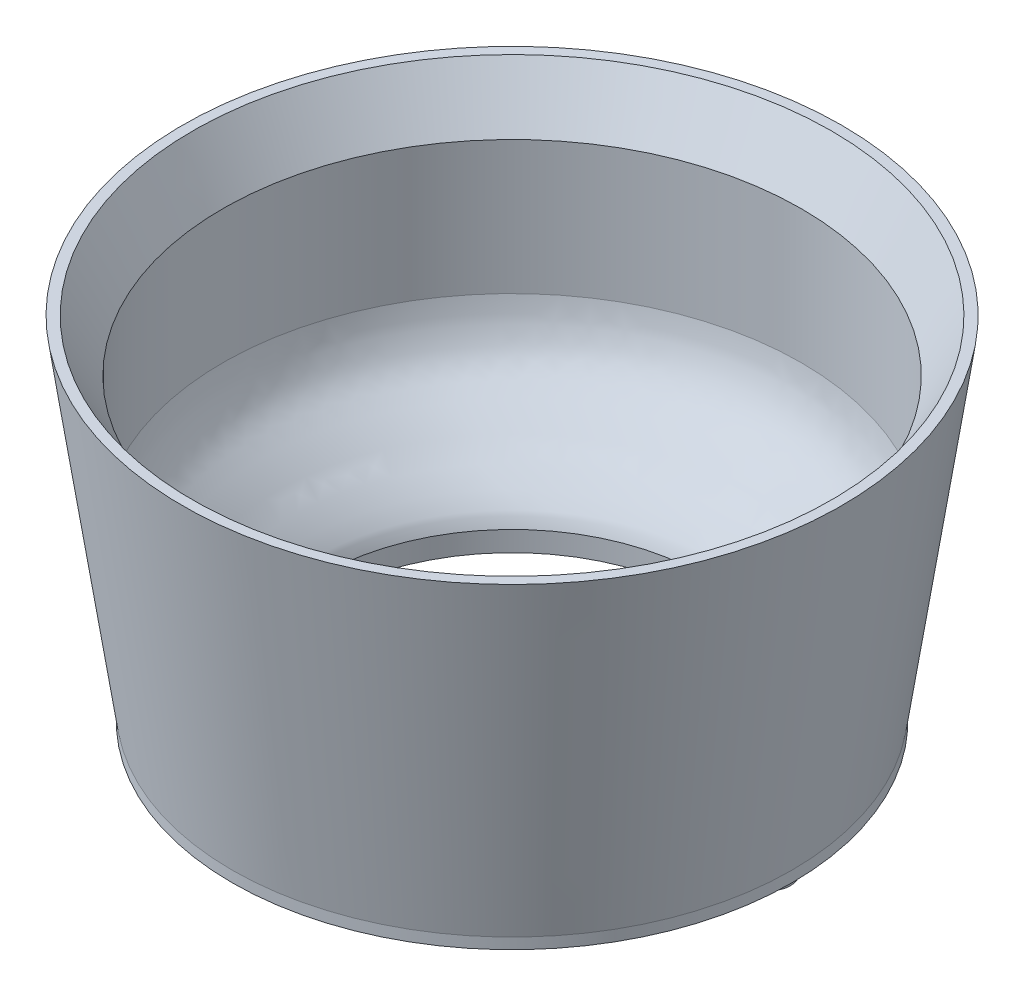
ISO-10303-21;
HEADER;
FILE_DESCRIPTION(('STEP AP214'),'2;1');
FILE_NAME('part.step','',(''),(''),'','','');
FILE_SCHEMA(('AUTOMOTIVE_DESIGN { 1 0 10303 214 1 1 1 1 }'));
ENDSEC;
DATA;
#1=APPLICATION_CONTEXT('core data for automotive mechanical design processes');
#2=APPLICATION_PROTOCOL_DEFINITION('international standard','automotive_design',2000,#1);
#3=PRODUCT_CONTEXT('',#1,'mechanical');
#4=PRODUCT('Part','Part','',(#3));
#5=PRODUCT_RELATED_PRODUCT_CATEGORY('part','',(#4));
#6=PRODUCT_DEFINITION_FORMATION('','',#4);
#7=PRODUCT_DEFINITION_CONTEXT('part definition',#1,'design');
#8=PRODUCT_DEFINITION('design','',#6,#7);
#9=PRODUCT_DEFINITION_SHAPE('','',#8);
#10=(LENGTH_UNIT() NAMED_UNIT(*) SI_UNIT(.MILLI.,.METRE.));
#11=(NAMED_UNIT(*) PLANE_ANGLE_UNIT() SI_UNIT($,.RADIAN.));
#12=(NAMED_UNIT(*) SI_UNIT($,.STERADIAN.) SOLID_ANGLE_UNIT());
#13=UNCERTAINTY_MEASURE_WITH_UNIT(LENGTH_MEASURE(1.E-05),#10,'distance_accuracy_value','');
#14=(GEOMETRIC_REPRESENTATION_CONTEXT(3) GLOBAL_UNCERTAINTY_ASSIGNED_CONTEXT((#13)) GLOBAL_UNIT_ASSIGNED_CONTEXT((#10,
#11,#12)) REPRESENTATION_CONTEXT('',''));
#15=CARTESIAN_POINT('',(0.,0.,0.));
#16=DIRECTION('',(0.,0.,1.));
#17=DIRECTION('',(1.,0.,0.));
#18=AXIS2_PLACEMENT_3D('',#15,#16,#17);
#19=CARTESIAN_POINT('',(0.,295.540718437762,-40.5476747547934));
#20=CARTESIAN_POINT('',(0.,295.012709615636,-40.4477404657415));
#21=CARTESIAN_POINT('',(0.,293.970757618623,-40.2927773525862));
#22=CARTESIAN_POINT('',(0.,292.587532752845,-39.930889754875));
#23=CARTESIAN_POINT('',(0.,291.581451359409,-39.51618641559));
#24=CARTESIAN_POINT('',(0.,290.578047280025,-39.1083707824325));
#25=CARTESIAN_POINT('',(0.,289.316986818185,-38.4396980542591));
#26=CARTESIAN_POINT('',(0.,288.032583078736,-37.3314160861705));
#27=CARTESIAN_POINT('',(0.,287.115418473763,-36.3683638812662));
#28=CARTESIAN_POINT('',(0.,286.340079672536,-35.6302312643945));
#29=CARTESIAN_POINT('',(0.,285.762737125999,-35.0164727262729));
#30=CARTESIAN_POINT('',(0.,285.247169223289,-34.3942597952709));
#31=CARTESIAN_POINT('',(0.,284.556557999368,-33.6355246615368));
#32=CARTESIAN_POINT('',(0.,283.771384037677,-32.9203613336381));
#33=CARTESIAN_POINT('',(0.,282.986073935963,-32.12965190107));
#34=CARTESIAN_POINT('',(0.,282.459482322822,-31.4852417836461));
#35=CARTESIAN_POINT('',(0.,281.963476572773,-30.9149972084707));
#36=CARTESIAN_POINT('',(0.,281.391298158875,-30.3717003462487));
#37=CARTESIAN_POINT('',(0.,280.804626849955,-29.7827961587849));
#38=CARTESIAN_POINT('',(0.,280.262154528045,-29.2275845813112));
#39=CARTESIAN_POINT('',(0.,279.674853681479,-28.7247526180959));
#40=CARTESIAN_POINT('',(0.,279.039651715273,-28.1803862534295));
#41=CARTESIAN_POINT('',(0.,278.470209991792,-27.651838315325));
#42=CARTESIAN_POINT('',(0.,277.876839186641,-27.3081459354535));
#43=CARTESIAN_POINT('',(0.,277.127164256162,-26.9952300805427));
#44=CARTESIAN_POINT('',(0.,276.164510632259,-26.5979526177344));
#45=CARTESIAN_POINT('',(0.,275.470548140668,-26.4648115829165));
#46=CARTESIAN_POINT('',(0.,274.996982716808,-26.5077562004189));
#47=B_SPLINE_CURVE_WITH_KNOTS('',3,(#19,#20,#21,#22,#23,#24,#25,#26,#27,#28,#29,#30,#31,#32,#33,
#34,#35,#36,#37,#38,#39,#40,#41,#42,#43,#44,#45,#46),.UNSPECIFIED.,.F.,.F.,(4,1,1,1,1,1,1,1,1,1,
1,1,1,1,1,1,1,1,1,1,1,1,1,1,1,4),(0.,0.0625440482121128,0.125088096424226,0.156360120530282,
0.187632144636338,0.250176192848451,0.312720241060564,0.375264289272677,0.406536313378733,
0.43780833748479,0.469080361590846,0.500352385696902,0.562896433909015,0.594168458015071,
0.625440482121128,0.656712506227184,0.687984530333241,0.719256554439297,0.750528578545353,
0.78180060265141,0.813072626757466,0.844344650863523,0.875616674969579,0.906888699075636,
0.938160723181692,1.0007047713938),.UNSPECIFIED.);
#48=CARTESIAN_POINT('',(0.,5.,0.));
#49=DIRECTION('',(0.,-1.,0.));
#50=AXIS1_PLACEMENT('',#48,#49);
#51=SURFACE_OF_REVOLUTION('',#47,#50);
#52=CARTESIAN_POINT('',(0.,276.641394028295,8.7005807280947E-13));
#53=DIRECTION('',(0.,-1.,0.));
#54=DIRECTION('',(0.,0.,-1.));
#55=AXIS2_PLACEMENT_3D('',#52,#53,#54);
#56=CIRCLE('',#55,26.8);
#57=CARTESIAN_POINT('',(0.,276.641394028295,-26.7999999999991));
#58=VERTEX_POINT('',#57);
#59=EDGE_CURVE('E58',#58,#58,#56,.F.);
#60=ORIENTED_EDGE('',*,*,#59,.F.);
#61=EDGE_LOOP('',(#60));
#62=FACE_BOUND('',#61,.T.);
#63=CARTESIAN_POINT('',(0.,295.540718437762,9.30591960996588E-13));
#64=DIRECTION('',(0.,-1.,0.));
#65=DIRECTION('',(0.,0.,-1.));
#66=AXIS2_PLACEMENT_3D('',#63,#64,#65);
#67=CIRCLE('',#66,40.5476747547944);
#68=CARTESIAN_POINT('',(0.,295.540718437762,-40.5476747547934));
#69=VERTEX_POINT('',#68);
#70=EDGE_CURVE('E50',#69,#69,#67,.T.);
#71=ORIENTED_EDGE('',*,*,#70,.F.);
#72=EDGE_LOOP('',(#71));
#73=FACE_BOUND('',#72,.T.);
#74=ADVANCED_FACE('F30',(#62,#73),#51,.F.);
#75=CARTESIAN_POINT('',(0.,5.,0.));
#76=DIRECTION('',(0.,-1.,0.));
#77=DIRECTION('',(0.,0.,-1.));
#78=AXIS2_PLACEMENT_3D('',#75,#76,#77);
#79=CYLINDRICAL_SURFACE('',#78,40.5476747547944);
#80=ORIENTED_EDGE('',*,*,#70,.T.);
#81=EDGE_LOOP('',(#80));
#82=FACE_BOUND('',#81,.T.);
#83=CARTESIAN_POINT('',(0.,314.238618936809,9.90480695303734E-13));
#84=DIRECTION('',(0.,-1.,0.));
#85=DIRECTION('',(0.,0.,-1.));
#86=AXIS2_PLACEMENT_3D('',#83,#84,#85);
#87=CIRCLE('',#86,40.5476747547944);
#88=CARTESIAN_POINT('',(0.,314.238618936809,-40.5476747547934));
#89=VERTEX_POINT('',#88);
#90=EDGE_CURVE('E136',#89,#89,#87,.T.);
#91=ORIENTED_EDGE('',*,*,#90,.F.);
#92=EDGE_LOOP('',(#91));
#93=FACE_BOUND('',#92,.T.);
#94=ADVANCED_FACE('F111',(#82,#93),#79,.F.);
#95=CARTESIAN_POINT('',(0.,321.561079724369,1.01393428618166E-12));
#96=DIRECTION('',(0.,1.,0.));
#97=DIRECTION('',(0.,0.,1.));
#98=AXIS2_PLACEMENT_3D('',#95,#96,#97);
#99=CONICAL_SURFACE('',#98,44.775299461623,0.523598775598309);
#100=ORIENTED_EDGE('',*,*,#90,.T.);
#101=EDGE_LOOP('',(#100));
#102=FACE_BOUND('',#101,.T.);
#103=CARTESIAN_POINT('',(0.,321.561079724369,1.01393428618166E-12));
#104=DIRECTION('',(0.,-1.,0.));
#105=DIRECTION('',(0.,0.,-1.));
#106=AXIS2_PLACEMENT_3D('',#103,#104,#105);
#107=CIRCLE('',#106,44.775299461623);
#108=CARTESIAN_POINT('',(0.,321.561079724369,-44.775299461622));
#109=VERTEX_POINT('',#108);
#110=EDGE_CURVE('E134',#109,#109,#107,.T.);
#111=ORIENTED_EDGE('',*,*,#110,.F.);
#112=EDGE_LOOP('',(#111));
#113=FACE_BOUND('',#112,.T.);
#114=ADVANCED_FACE('F107',(#102,#113),#99,.F.);
#115=CARTESIAN_POINT('',(0.,321.561079724369,-44.775299461622));
#116=DIRECTION('',(0.,1.,0.));
#117=DIRECTION('',(0.,0.,1.));
#118=AXIS2_PLACEMENT_3D('',#115,#116,#117);
#119=PLANE('',#118);
#120=ORIENTED_EDGE('',*,*,#110,.T.);
#121=EDGE_LOOP('',(#120));
#122=FACE_BOUND('',#121,.T.);
#123=CARTESIAN_POINT('',(0.,321.561079724369,1.01393428618166E-12));
#124=DIRECTION('',(0.,-1.,0.));
#125=DIRECTION('',(0.,0.,-1.));
#126=AXIS2_PLACEMENT_3D('',#123,#124,#125);
#127=CIRCLE('',#126,46.181267187361);
#128=CARTESIAN_POINT('',(0.,321.561079724369,-46.1812671873599));
#129=VERTEX_POINT('',#128);
#130=EDGE_CURVE('E131',#129,#129,#127,.T.);
#131=ORIENTED_EDGE('',*,*,#130,.F.);
#132=EDGE_LOOP('',(#131));
#133=FACE_BOUND('',#132,.T.);
#134=ADVANCED_FACE('F103',(#122,#133),#119,.T.);
#135=CARTESIAN_POINT('',(0.,273.84861893681,8.61112909931847E-13));
#136=DIRECTION('',(0.,1.,0.));
#137=DIRECTION('',(0.,0.,1.));
#138=AXIS2_PLACEMENT_3D('',#135,#136,#137);
#139=CONICAL_SURFACE('',#138,39.2207719119618,0.144862327915536);
#140=ORIENTED_EDGE('',*,*,#130,.T.);
#141=EDGE_LOOP('',(#140));
#142=FACE_BOUND('',#141,.T.);
#143=CARTESIAN_POINT('',(0.,273.84861893681,8.61112909931847E-13));
#144=DIRECTION('',(0.,-1.,0.));
#145=DIRECTION('',(0.,0.,-1.));
#146=AXIS2_PLACEMENT_3D('',#143,#144,#145);
#147=CIRCLE('',#146,39.2207719119618);
#148=CARTESIAN_POINT('',(0.,273.84861893681,-39.2207719119609));
#149=VERTEX_POINT('',#148);
#150=EDGE_CURVE('E125',#149,#149,#147,.T.);
#151=ORIENTED_EDGE('',*,*,#150,.F.);
#152=EDGE_LOOP('',(#151));
#153=FACE_BOUND('',#152,.T.);
#154=ADVANCED_FACE('F79',(#142,#153),#139,.T.);
#155=CARTESIAN_POINT('',(0.,-0.122002410112787,0.));
#156=DIRECTION('',(0.,-1.,0.));
#157=DIRECTION('',(0.,0.,-1.));
#158=AXIS2_PLACEMENT_3D('',#155,#156,#157);
#159=SPHERICAL_SURFACE('',#158,275.25);
#160=CARTESIAN_POINT('',(0.,273.820185834049,8.7703666827114E-13));
#161=DIRECTION('',(0.,-1.,0.));
#162=DIRECTION('',(0.,0.,-1.));
#163=AXIS2_PLACEMENT_3D('',#160,#161,#162);
#164=CIRCLE('',#163,26.8);
#165=CARTESIAN_POINT('',(0.,273.82018583405,-26.7999999999991));
#166=VERTEX_POINT('',#165);
#167=EDGE_CURVE('E34',#166,#166,#164,.T.);
#168=ORIENTED_EDGE('',*,*,#167,.F.);
#169=EDGE_LOOP('',(#168));
#170=FACE_BOUND('',#169,.T.);
#171=CARTESIAN_POINT('',(0.,272.319355593091,8.56214731867291E-13));
#172=DIRECTION('',(0.,-1.,0.));
#173=DIRECTION('',(0.,0.,-1.));
#174=AXIS2_PLACEMENT_3D('',#171,#172,#173);
#175=CIRCLE('',#174,39.2207719119618);
#176=CARTESIAN_POINT('',(0.,272.319355593091,-39.2207719119609));
#177=VERTEX_POINT('',#176);
#178=EDGE_CURVE('E68',#177,#177,#175,.T.);
#179=ORIENTED_EDGE('',*,*,#178,.T.);
#180=EDGE_LOOP('',(#179));
#181=FACE_BOUND('',#180,.T.);
#182=CARTESIAN_POINT('',(33.8749546324797,273.027343915968,-2.11758970404298));
#183=CARTESIAN_POINT('',(33.9946255918528,273.011571570247,-2.23767123551081));
#184=CARTESIAN_POINT('',(34.1245040968203,272.994453356898,-2.3475887353589));
#185=CARTESIAN_POINT('',(34.4008520390891,272.958025441235,-2.54391922780289));
#186=CARTESIAN_POINT('',(34.5473429744087,272.938712899193,-2.6303012602179));
#187=CARTESIAN_POINT('',(34.8524966071203,272.898478715978,-2.77702394144181));
#188=CARTESIAN_POINT('',(35.0111496063841,272.877558356857,-2.83738509025877));
#189=CARTESIAN_POINT('',(35.3361722412429,272.834694827109,-2.93051356725582));
#190=CARTESIAN_POINT('',(35.5025399050803,272.812751917823,-2.96328790566186));
#191=CARTESIAN_POINT('',(35.839196082136,272.768343470642,-3.00049354247543));
#192=CARTESIAN_POINT('',(36.0094999093397,272.745875885781,-3.00478396400958));
#193=CARTESIAN_POINT('',(36.3484233203112,272.70115738697,-2.98453076823693));
#194=CARTESIAN_POINT('',(36.5170427982252,272.67890648664,-2.95998535008121));
#195=CARTESIAN_POINT('',(36.8481518335042,272.635208395365,-2.88263766802271));
#196=CARTESIAN_POINT('',(37.0106282485456,272.613762928131,-2.82977812849712));
#197=CARTESIAN_POINT('',(37.3244311609616,272.572339089419,-2.69720093371106));
#198=CARTESIAN_POINT('',(37.4757578057846,272.552360698539,-2.61748363370416));
#199=CARTESIAN_POINT('',(37.7623667279895,272.514518351287,-2.43370928123283));
#200=CARTESIAN_POINT('',(37.8977035791574,272.496647203254,-2.32973884689504));
#201=CARTESIAN_POINT('',(38.1489845520952,272.46346288134,-2.10019514455802));
#202=CARTESIAN_POINT('',(38.2649294547086,272.448149604462,-1.9746227468048));
#203=CARTESIAN_POINT('',(38.4731849063026,272.42064264764,-1.70644692772509));
#204=CARTESIAN_POINT('',(38.5656677224036,272.408426229969,-1.56397962653297));
#205=CARTESIAN_POINT('',(38.725377430689,272.387328506853,-1.26530317804507));
#206=CARTESIAN_POINT('',(38.792605507785,272.378447044938,-1.10909467588874));
#207=CARTESIAN_POINT('',(38.8993323929752,272.364347004578,-0.788758022024961));
#208=CARTESIAN_POINT('',(38.9390555814838,272.359098786785,-0.624705914163987));
#209=CARTESIAN_POINT('',(38.9904718889534,272.35230561865,-0.29219319561628));
#210=CARTESIAN_POINT('',(39.0021660234469,272.350760534138,-0.123732744873655));
#211=CARTESIAN_POINT('',(38.997186659629,272.351418423116,0.211869858490369));
#212=CARTESIAN_POINT('',(38.9806621553328,272.353601710853,0.379014282792876));
#213=CARTESIAN_POINT('',(38.9200259402605,272.361612965465,0.708128761398616));
#214=CARTESIAN_POINT('',(38.8759144524269,272.367440902886,0.870098857506726));
#215=CARTESIAN_POINT('',(38.7614128306319,272.38256788735,1.18429669928788));
#216=CARTESIAN_POINT('',(38.6910217854247,272.391867054758,1.33652410691797));
#217=CARTESIAN_POINT('',(38.5260296593685,272.413662196915,1.62698297464568));
#218=CARTESIAN_POINT('',(38.4314280560132,272.426158240656,1.76521413258992));
#219=CARTESIAN_POINT('',(38.2201959771322,272.454057772523,2.02456087718759));
#220=CARTESIAN_POINT('',(38.1034519102156,272.469476252536,2.14558231389962));
#221=CARTESIAN_POINT('',(37.8516224269834,272.50273227336,2.3663337965269));
#222=CARTESIAN_POINT('',(37.7165362475426,272.52056991482,2.46606295613066));
#223=CARTESIAN_POINT('',(37.4306737427883,272.558312884213,2.64227054268679));
#224=CARTESIAN_POINT('',(37.2797778288821,272.57823396943,2.71855158458783));
#225=CARTESIAN_POINT('',(36.967497890215,272.61945589135,2.84469853046805));
#226=CARTESIAN_POINT('',(36.8061134047961,272.640756788655,2.8945632733625));
#227=CARTESIAN_POINT('',(36.4761246940793,272.684306166946,2.96682453643983));
#228=CARTESIAN_POINT('',(36.307475029939,272.706560604882,2.98901006648788));
#229=CARTESIAN_POINT('',(35.9688695627536,272.751236274951,3.00462269388512));
#230=CARTESIAN_POINT('',(35.798913722962,272.773657511775,2.99804897917407));
#231=CARTESIAN_POINT('',(35.4618658165989,272.818116768555,2.95623968415439));
#232=CARTESIAN_POINT('',(35.2947865206912,272.840153083914,2.92089920176638));
#233=CARTESIAN_POINT('',(34.9688973958066,272.88313005006,2.82237568789331));
#234=CARTESIAN_POINT('',(34.8100875459998,272.904070703606,2.75919272654443));
#235=CARTESIAN_POINT('',(34.5055927083349,272.944217081892,2.60685121726622));
#236=CARTESIAN_POINT('',(34.3598836369428,272.96342599033,2.51774166417435));
#237=CARTESIAN_POINT('',(34.0854934513466,272.99959559915,2.31595836331211));
#238=CARTESIAN_POINT('',(33.9568118367102,273.016556365603,2.20328530831777));
#239=CARTESIAN_POINT('',(33.7210614432233,273.047626788406,1.95835161463734));
#240=CARTESIAN_POINT('',(33.6138552678917,273.061754570388,1.82622554007228));
#241=CARTESIAN_POINT('',(33.423178976413,273.086880630153,1.54556492022524));
#242=CARTESIAN_POINT('',(33.3397077882082,273.097879049283,1.39703111646558));
#243=CARTESIAN_POINT('',(33.1996066210056,273.116338435794,1.0891134663106));
#244=CARTESIAN_POINT('',(33.1427569053951,273.123828362834,0.929831324859043));
#245=CARTESIAN_POINT('',(33.056574865539,273.135182568052,0.603872719925396));
#246=CARTESIAN_POINT('',(33.0272402992623,273.139047141638,0.437196860068817));
#247=CARTESIAN_POINT('',(32.9970685303585,273.143022007651,0.102355018709671));
#248=CARTESIAN_POINT('',(32.9960445789547,273.143156902615,-0.0657938749417435));
#249=CARTESIAN_POINT('',(33.022056314508,273.139730087022,-0.399913198409728));
#250=CARTESIAN_POINT('',(33.0490985786319,273.136167509983,-0.565883108361235));
#251=CARTESIAN_POINT('',(33.1303797820679,273.125459036982,-0.890663442453825));
#252=CARTESIAN_POINT('',(33.1845850724319,273.118317574464,-1.04948246032236));
#253=CARTESIAN_POINT('',(33.3185413833028,273.100667926415,-1.35559162359865));
#254=CARTESIAN_POINT('',(33.3982616194472,273.090163798015,-1.50289539728304));
#255=CARTESIAN_POINT('',(33.5454921535454,273.070763135133,-1.72796945223022));
#256=CARTESIAN_POINT('',(33.6058183344297,273.062813667146,-1.81061481959806));
#257=CARTESIAN_POINT('',(33.7345138007604,273.045853486122,-1.96926552105312));
#258=CARTESIAN_POINT('',(33.8028830662077,273.036842775724,-2.04527087164987));
#259=CARTESIAN_POINT('',(33.8749546324797,273.027343915968,-2.11758970404298));
#260=B_SPLINE_CURVE_WITH_KNOTS('',3,(#182,#183,#184,#185,#186,#187,#188,#189,#190,#191,#192,
#193,#194,#195,#196,#197,#198,#199,#200,#201,#202,#203,#204,#205,#206,#207,#208,#209,#210,#211,
#212,#213,#214,#215,#216,#217,#218,#219,#220,#221,#222,#223,#224,#225,#226,#227,#228,#229,#230,
#231,#232,#233,#234,#235,#236,#237,#238,#239,#240,#241,#242,#243,#244,#245,#246,#247,#248,#249,
#250,#251,#252,#253,#254,#255,#256,#257,#258,#259),.UNSPECIFIED.,.T.,.F.,(4,2,2,2,2,2,2,2,2,2,2,
2,2,2,2,2,2,2,2,2,2,2,2,2,2,2,2,2,2,2,2,2,2,2,2,2,2,2,4),(0.,0.510411092370759,1.02149040809802,
1.53216634155756,2.04271246532371,2.5557817990423,3.06888317654705,3.5830264300257,
4.09716288308411,4.60949051592829,5.12179751422618,5.6302263655349,6.13863135920392,
6.64283838944448,7.14702715127048,7.64856202702369,8.15009284970795,8.65164106463003,
9.1532001047521,9.65740538010273,10.1616316393923,10.669993025179,11.1783767532964,
11.6906125162721,12.2028627430832,12.7169893759339,13.2311147136892,13.7442747231982,
14.2574196477259,14.7671686120987,15.2768945485609,15.7823355774705,16.2877354176861,
16.7898006259682,17.2919835171062,17.7935458475026,18.2945052984356,18.6018999957717,
18.9092939287899),.UNSPECIFIED.);
#261=CARTESIAN_POINT('',(33.8749546324797,273.027343915968,-2.11758970404298));
#262=VERTEX_POINT('',#261);
#263=EDGE_CURVE('E59',#262,#262,#260,.T.);
#264=ORIENTED_EDGE('',*,*,#263,.F.);
#265=EDGE_LOOP('',(#264));
#266=FACE_BOUND('',#265,.T.);
#267=CARTESIAN_POINT('',(-33.2590103588884,272.651694686228,15.8401673709966));
#268=CARTESIAN_POINT('',(-33.1366486523362,272.67346331601,15.7222201356085));
#269=CARTESIAN_POINT('',(-33.0041923593675,272.695698577436,15.6146460661028));
#270=CARTESIAN_POINT('',(-32.7229016548393,272.740458799461,15.4233902340738));
#271=CARTESIAN_POINT('',(-32.5740469324512,272.7629840881,15.3397385729914));
#272=CARTESIAN_POINT('',(-32.2643340630194,272.807658096591,15.1988511914902));
#273=CARTESIAN_POINT('',(-32.103481467295,272.829806984846,15.1416033412438));
#274=CARTESIAN_POINT('',(-31.7743239375758,272.873100586927,15.0551651332863));
#275=CARTESIAN_POINT('',(-31.6060209932402,272.894245565764,15.0259673313698));
#276=CARTESIAN_POINT('',(-31.2668970854563,272.934909427738,14.9965292896966));
#277=CARTESIAN_POINT('',(-31.0960791872777,272.954430124088,14.9962563153222));
#278=CARTESIAN_POINT('',(-30.7566278748874,272.991307156339,15.0247072463608));
#279=CARTESIAN_POINT('',(-30.5879944920737,273.008663461162,15.0534315680841));
#280=CARTESIAN_POINT('',(-30.258859680762,273.040598684209,15.1388986912946));
#281=CARTESIAN_POINT('',(-30.0983134330176,273.055194530902,15.1954625069505));
#282=CARTESIAN_POINT('',(-29.7888766248049,273.08131320188,15.3350135675391));
#283=CARTESIAN_POINT('',(-29.6399854890361,273.09283617791,15.4179995072401));
#284=CARTESIAN_POINT('',(-29.3594174423863,273.112381147074,15.6072816783837));
#285=CARTESIAN_POINT('',(-29.2276061970739,273.120431789518,15.7133758436361));
#286=CARTESIAN_POINT('',(-28.9835806397011,273.132931538664,15.9462883044705));
#287=CARTESIAN_POINT('',(-28.871365456445,273.137380805508,16.0731056782607));
#288=CARTESIAN_POINT('',(-28.6704875209152,273.142526546222,16.3429178513289));
#289=CARTESIAN_POINT('',(-28.5816704642277,273.143248222176,16.4857973189748));
#290=CARTESIAN_POINT('',(-28.4291351870777,273.140985384571,16.7843490730782));
#291=CARTESIAN_POINT('',(-28.3654164944494,273.138000940737,16.9400211188073));
#292=CARTESIAN_POINT('',(-28.2649708091762,273.12842533878,17.2593638631004));
#293=CARTESIAN_POINT('',(-28.2281860336537,273.121841955021,17.4230166302817));
#294=CARTESIAN_POINT('',(-28.1823543442891,273.105267922482,17.7539891453095));
#295=CARTESIAN_POINT('',(-28.1733077078797,273.095277239625,17.921308929816));
#296=CARTESIAN_POINT('',(-28.1831261664541,273.072140728118,18.2554710279103));
#297=CARTESIAN_POINT('',(-28.2020853404779,273.058984389609,18.4223098371341));
#298=CARTESIAN_POINT('',(-28.2674384393132,273.029914747768,18.750273303905));
#299=CARTESIAN_POINT('',(-28.3138333361058,273.014001346774,18.911397758792));
#300=CARTESIAN_POINT('',(-28.4330930713117,272.979743541132,19.2246368885784));
#301=CARTESIAN_POINT('',(-28.50615116394,272.961382025522,19.3766761045067));
#302=CARTESIAN_POINT('',(-28.6765353477189,272.922841463081,19.6662311592779));
#303=CARTESIAN_POINT('',(-28.7738625354782,272.902662334146,19.8037463414467));
#304=CARTESIAN_POINT('',(-28.9908975198557,272.86087981763,20.0615411562449));
#305=CARTESIAN_POINT('',(-29.1107831024872,272.839266065422,20.1816694515712));
#306=CARTESIAN_POINT('',(-29.3689859988126,272.795374076721,20.3999961123806));
#307=CARTESIAN_POINT('',(-29.507303982277,272.773095816103,20.4981936806289));
#308=CARTESIAN_POINT('',(-29.7992892307647,272.728375703867,20.6703994037194));
#309=CARTESIAN_POINT('',(-29.9530370919048,272.705933628549,20.7442708896778));
#310=CARTESIAN_POINT('',(-30.2708902356241,272.66164512563,20.8649642236761));
#311=CARTESIAN_POINT('',(-30.4349956323834,272.639798704601,20.9117857734634));
#312=CARTESIAN_POINT('',(-30.7689824475017,272.597316565374,20.9770038049085));
#313=CARTESIAN_POINT('',(-30.938866026319,272.576681308068,20.9953895323297));
#314=CARTESIAN_POINT('',(-31.2795038086945,272.53722654336,21.0030811723651));
#315=CARTESIAN_POINT('',(-31.4502579948654,272.518406999844,20.9923876634768));
#316=CARTESIAN_POINT('',(-31.7868716256231,272.483223297653,20.942237923923));
#317=CARTESIAN_POINT('',(-31.9527512377912,272.466847359041,20.9029254368069));
#318=CARTESIAN_POINT('',(-32.2756987913944,272.436923163682,20.796705802933));
#319=CARTESIAN_POINT('',(-32.4327671245241,272.423374781167,20.7297998839132));
#320=CARTESIAN_POINT('',(-32.7322599692915,272.39961022253,20.5708762614444));
#321=CARTESIAN_POINT('',(-32.8747936998702,272.389367710379,20.4790683240031));
#322=CARTESIAN_POINT('',(-33.1425120752307,272.372372243099,20.2726617240622));
#323=CARTESIAN_POINT('',(-33.2676974990849,272.365619131232,20.1580640855586));
#324=CARTESIAN_POINT('',(-33.496163371191,272.355845357645,19.9103042874843));
#325=CARTESIAN_POINT('',(-33.5996054684722,272.352796283253,19.7772922793833));
#326=CARTESIAN_POINT('',(-33.7828112584668,272.35042759076,19.4958264476924));
#327=CARTESIAN_POINT('',(-33.8625755738438,272.351107874577,19.3473730303096));
#328=CARTESIAN_POINT('',(-33.9958955794366,272.356167402743,19.0398672089342));
#329=CARTESIAN_POINT('',(-34.0495500452192,272.360532532809,18.8808573780482));
#330=CARTESIAN_POINT('',(-34.1296272911819,272.372812384794,18.556263912617));
#331=CARTESIAN_POINT('',(-34.1560511302938,272.380726968666,18.3906805339611));
#332=CARTESIAN_POINT('',(-34.1810268251986,272.399886666893,18.0573516997349));
#333=CARTESIAN_POINT('',(-34.1795337647503,272.411137119794,17.8896031939531));
#334=CARTESIAN_POINT('',(-34.1487083219511,272.436638123553,17.5568725190563));
#335=CARTESIAN_POINT('',(-34.1193682254805,272.450889504868,17.3918911293696));
#336=CARTESIAN_POINT('',(-34.0334886837072,272.482085456156,17.0682135313135));
#337=CARTESIAN_POINT('',(-33.9767617403481,272.499048044216,16.9095689354786));
#338=CARTESIAN_POINT('',(-33.8377659883106,272.535095767158,16.6043155632237));
#339=CARTESIAN_POINT('',(-33.7555266008731,272.554178440944,16.4576931676599));
#340=CARTESIAN_POINT('',(-33.6031946058346,272.586460136023,16.2324793852584));
#341=CARTESIAN_POINT('',(-33.54010744078,272.599182779563,16.1489913955352));
#342=CARTESIAN_POINT('',(-33.4056216518477,272.625109741319,15.9890849639768));
#343=CARTESIAN_POINT('',(-33.334222998575,272.638314061239,15.9126665471461));
#344=CARTESIAN_POINT('',(-33.2590103588884,272.651694686228,15.8401673709966));
#345=B_SPLINE_CURVE_WITH_KNOTS('',3,(#267,#268,#269,#270,#271,#272,#273,#274,#275,#276,#277,
#278,#279,#280,#281,#282,#283,#284,#285,#286,#287,#288,#289,#290,#291,#292,#293,#294,#295,#296,
#297,#298,#299,#300,#301,#302,#303,#304,#305,#306,#307,#308,#309,#310,#311,#312,#313,#314,#315,
#316,#317,#318,#319,#320,#321,#322,#323,#324,#325,#326,#327,#328,#329,#330,#331,#332,#333,#334,
#335,#336,#337,#338,#339,#340,#341,#342,#343,#344),.UNSPECIFIED.,.T.,.F.,(4,2,2,2,2,2,2,2,2,2,2,
2,2,2,2,2,2,2,2,2,2,2,2,2,2,2,2,2,2,2,2,2,2,2,2,2,2,2,4),(0.,0.513638961778382,1.02792141725839,
1.54196737709242,2.05587687649453,2.56920477136186,3.08254003611507,3.5926172451776,
4.10266926074227,4.60842849359118,5.11416523582066,5.61647819531593,6.11878170453939,
6.62000441026349,7.12123212912766,7.62414744017898,8.12708056936988,8.63373378923373,
9.14040990657586,9.65126050053787,10.1621296621286,10.6758218777721,11.1895197572777,
11.7034118663974,12.2172937523073,12.7286122345067,13.2399079686336,13.7470237468639,
14.2541167443108,14.7572948957537,15.2604598137583,15.7617061291419,16.2629329515558,
16.7649662804107,17.2671387219473,17.7727990086306,18.2778783163298,18.5935980510105,
18.9093189023275),.UNSPECIFIED.);
#346=CARTESIAN_POINT('',(-33.2590103588884,272.651694686228,15.8401673709966));
#347=VERTEX_POINT('',#346);
#348=EDGE_CURVE('E67',#347,#347,#345,.T.);
#349=ORIENTED_EDGE('',*,*,#348,.F.);
#350=EDGE_LOOP('',(#349));
#351=FACE_BOUND('',#350,.T.);
#352=ADVANCED_FACE('F74',(#170,#181,#266,#351),#159,.F.);
#353=CARTESIAN_POINT('',(0.,5.,0.));
#354=DIRECTION('',(0.,-1.,0.));
#355=DIRECTION('',(0.,0.,-1.));
#356=AXIS2_PLACEMENT_3D('',#353,#354,#355);
#357=CYLINDRICAL_SURFACE('',#356,39.2207719119618);
#358=ORIENTED_EDGE('',*,*,#150,.T.);
#359=EDGE_LOOP('',(#358));
#360=FACE_BOUND('',#359,.T.);
#361=ORIENTED_EDGE('',*,*,#178,.F.);
#362=EDGE_LOOP('',(#361));
#363=FACE_BOUND('',#362,.T.);
#364=ADVANCED_FACE('F78',(#360,#363),#357,.T.);
#365=CARTESIAN_POINT('',(-31.1769145362399,271.84861893681,18.0000000000007));
#366=DIRECTION('',(0.,-1.,0.));
#367=DIRECTION('',(0.,0.,-1.));
#368=AXIS2_PLACEMENT_3D('',#365,#366,#367);
#369=PLANE('',#368);
#370=CARTESIAN_POINT('',(-31.1769145362399,271.84861893681,18.0000000000007));
#371=DIRECTION('',(0.,-1.,0.));
#372=DIRECTION('',(0.,0.,-1.));
#373=AXIS2_PLACEMENT_3D('',#370,#371,#372);
#374=CIRCLE('',#373,2.55);
#375=CARTESIAN_POINT('',(-31.1769145362399,271.84861893681,15.4500000000007));
#376=VERTEX_POINT('',#375);
#377=EDGE_CURVE('E47',#376,#376,#374,.F.);
#378=ORIENTED_EDGE('',*,*,#377,.T.);
#379=EDGE_LOOP('',(#378));
#380=FACE_BOUND('',#379,.T.);
#381=CARTESIAN_POINT('',(-31.1769145362399,271.84861893681,18.0000000000007));
#382=DIRECTION('',(0.,-1.,0.));
#383=DIRECTION('',(0.,0.,-1.));
#384=AXIS2_PLACEMENT_3D('',#381,#382,#383);
#385=CIRCLE('',#384,3.);
#386=CARTESIAN_POINT('',(-31.1769145362399,271.84861893681,15.0000000000007));
#387=VERTEX_POINT('',#386);
#388=EDGE_CURVE('E124',#387,#387,#385,.T.);
#389=ORIENTED_EDGE('',*,*,#388,.T.);
#390=EDGE_LOOP('',(#389));
#391=FACE_BOUND('',#390,.T.);
#392=ADVANCED_FACE('F99',(#380,#391),#369,.T.);
#393=CARTESIAN_POINT('',(-31.1769145362399,271.84861893681,18.0000000000007));
#394=DIRECTION('',(0.,1.,0.));
#395=DIRECTION('',(0.,0.,1.));
#396=AXIS2_PLACEMENT_3D('',#393,#394,#395);
#397=CYLINDRICAL_SURFACE('',#396,3.);
#398=ORIENTED_EDGE('',*,*,#348,.T.);
#399=EDGE_LOOP('',(#398));
#400=FACE_BOUND('',#399,.T.);
#401=ORIENTED_EDGE('',*,*,#388,.F.);
#402=EDGE_LOOP('',(#401));
#403=FACE_BOUND('',#402,.T.);
#404=ADVANCED_FACE('F95',(#400,#403),#397,.T.);
#405=CARTESIAN_POINT('',(36.,271.84861893681,8.70721807087471E-13));
#406=DIRECTION('',(0.,-1.,0.));
#407=DIRECTION('',(0.,0.,-1.));
#408=AXIS2_PLACEMENT_3D('',#405,#406,#407);
#409=PLANE('',#408);
#410=CARTESIAN_POINT('',(36.,271.84861893681,8.70721807087471E-13));
#411=DIRECTION('',(0.,-1.,0.));
#412=DIRECTION('',(0.,0.,-1.));
#413=AXIS2_PLACEMENT_3D('',#410,#411,#412);
#414=CIRCLE('',#413,2.55000000000001);
#415=CARTESIAN_POINT('',(36.,271.84861893681,-2.54999999999914));
#416=VERTEX_POINT('',#415);
#417=EDGE_CURVE('E42',#416,#416,#414,.F.);
#418=ORIENTED_EDGE('',*,*,#417,.T.);
#419=EDGE_LOOP('',(#418));
#420=FACE_BOUND('',#419,.T.);
#421=CARTESIAN_POINT('',(36.,271.84861893681,8.70721807087471E-13));
#422=DIRECTION('',(0.,-1.,0.));
#423=DIRECTION('',(0.,0.,-1.));
#424=AXIS2_PLACEMENT_3D('',#421,#422,#423);
#425=CIRCLE('',#424,3.);
#426=CARTESIAN_POINT('',(36.,271.84861893681,-2.99999999999913));
#427=VERTEX_POINT('',#426);
#428=EDGE_CURVE('E92',#427,#427,#425,.T.);
#429=ORIENTED_EDGE('',*,*,#428,.T.);
#430=EDGE_LOOP('',(#429));
#431=FACE_BOUND('',#430,.T.);
#432=ADVANCED_FACE('F82',(#420,#431),#409,.T.);
#433=CARTESIAN_POINT('',(36.,271.84861893681,8.70721807087471E-13));
#434=DIRECTION('',(0.,1.,0.));
#435=DIRECTION('',(0.,0.,1.));
#436=AXIS2_PLACEMENT_3D('',#433,#434,#435);
#437=CYLINDRICAL_SURFACE('',#436,3.);
#438=ORIENTED_EDGE('',*,*,#263,.T.);
#439=EDGE_LOOP('',(#438));
#440=FACE_BOUND('',#439,.T.);
#441=ORIENTED_EDGE('',*,*,#428,.F.);
#442=EDGE_LOOP('',(#441));
#443=FACE_BOUND('',#442,.T.);
#444=ADVANCED_FACE('F70',(#440,#443),#437,.T.);
#445=CARTESIAN_POINT('',(-31.1769145362399,272.34861893681,18.0000000000007));
#446=DIRECTION('',(0.,-1.,0.));
#447=DIRECTION('',(0.,0.,-1.));
#448=AXIS2_PLACEMENT_3D('',#445,#446,#447);
#449=PLANE('',#448);
#450=CARTESIAN_POINT('',(-31.1769145362399,272.34861893681,18.0000000000007));
#451=DIRECTION('',(0.,-1.,0.));
#452=DIRECTION('',(0.,0.,-1.));
#453=AXIS2_PLACEMENT_3D('',#450,#451,#452);
#454=CIRCLE('',#453,2.05);
#455=CARTESIAN_POINT('',(-31.1769145362399,272.34861893681,15.9500000000007));
#456=VERTEX_POINT('',#455);
#457=EDGE_CURVE('E38',#456,#456,#454,.T.);
#458=ORIENTED_EDGE('',*,*,#457,.T.);
#459=EDGE_LOOP('',(#458));
#460=FACE_BOUND('',#459,.T.);
#461=CARTESIAN_POINT('',(-31.1769145362399,272.34861893681,18.0000000000007));
#462=DIRECTION('',(0.,-1.,0.));
#463=DIRECTION('',(0.,0.,-1.));
#464=AXIS2_PLACEMENT_3D('',#461,#462,#463);
#465=CIRCLE('',#464,1.5);
#466=CARTESIAN_POINT('',(-31.1769145362399,272.34861893681,16.5000000000007));
#467=VERTEX_POINT('',#466);
#468=EDGE_CURVE('E55',#467,#467,#465,.F.);
#469=ORIENTED_EDGE('',*,*,#468,.T.);
#470=EDGE_LOOP('',(#469));
#471=FACE_BOUND('',#470,.T.);
#472=ADVANCED_FACE('F182',(#460,#471),#449,.T.);
#473=CARTESIAN_POINT('',(36.,272.34861893681,8.72323289946742E-13));
#474=DIRECTION('',(0.,-1.,0.));
#475=DIRECTION('',(0.,0.,-1.));
#476=AXIS2_PLACEMENT_3D('',#473,#474,#475);
#477=PLANE('',#476);
#478=CARTESIAN_POINT('',(36.,272.34861893681,8.72323289946742E-13));
#479=DIRECTION('',(0.,-1.,0.));
#480=DIRECTION('',(0.,0.,-1.));
#481=AXIS2_PLACEMENT_3D('',#478,#479,#480);
#482=CIRCLE('',#481,2.05);
#483=CARTESIAN_POINT('',(36.,272.34861893681,-2.04999999999913));
#484=VERTEX_POINT('',#483);
#485=EDGE_CURVE('E10',#484,#484,#482,.T.);
#486=ORIENTED_EDGE('',*,*,#485,.T.);
#487=EDGE_LOOP('',(#486));
#488=FACE_BOUND('',#487,.T.);
#489=CARTESIAN_POINT('',(36.,272.34861893681,8.72323289946742E-13));
#490=DIRECTION('',(0.,-1.,0.));
#491=DIRECTION('',(0.,0.,-1.));
#492=AXIS2_PLACEMENT_3D('',#489,#490,#491);
#493=CIRCLE('',#492,1.5);
#494=CARTESIAN_POINT('',(36.,272.34861893681,-1.49999999999913));
#495=VERTEX_POINT('',#494);
#496=EDGE_CURVE('E51',#495,#495,#493,.F.);
#497=ORIENTED_EDGE('',*,*,#496,.T.);
#498=EDGE_LOOP('',(#497));
#499=FACE_BOUND('',#498,.T.);
#500=ADVANCED_FACE('F188',(#488,#499),#477,.T.);
#501=CARTESIAN_POINT('',(-31.1769145362399,277.84861893681,18.0000000000007));
#502=DIRECTION('',(0.,-1.,0.));
#503=DIRECTION('',(0.,0.,-1.));
#504=AXIS2_PLACEMENT_3D('',#501,#502,#503);
#505=PLANE('',#504);
#506=CARTESIAN_POINT('',(-31.1769145362399,277.84861893681,18.0000000000007));
#507=DIRECTION('',(0.,-1.,0.));
#508=DIRECTION('',(0.,0.,-1.));
#509=AXIS2_PLACEMENT_3D('',#506,#507,#508);
#510=CIRCLE('',#509,1.5);
#511=CARTESIAN_POINT('',(-31.1769145362399,277.84861893681,16.5000000000007));
#512=VERTEX_POINT('',#511);
#513=EDGE_CURVE('E54',#512,#512,#510,.T.);
#514=ORIENTED_EDGE('',*,*,#513,.T.);
#515=EDGE_LOOP('',(#514));
#516=FACE_BOUND('',#515,.T.);
#517=ADVANCED_FACE('F219',(#516),#505,.T.);
#518=CARTESIAN_POINT('',(-31.1769145362399,277.84861893681,18.0000000000007));
#519=DIRECTION('',(0.,-1.,0.));
#520=DIRECTION('',(0.,0.,-1.));
#521=AXIS2_PLACEMENT_3D('',#518,#519,#520);
#522=CYLINDRICAL_SURFACE('',#521,1.5);
#523=ORIENTED_EDGE('',*,*,#513,.F.);
#524=EDGE_LOOP('',(#523));
#525=FACE_BOUND('',#524,.T.);
#526=ORIENTED_EDGE('',*,*,#468,.F.);
#527=EDGE_LOOP('',(#526));
#528=FACE_BOUND('',#527,.T.);
#529=ADVANCED_FACE('F217',(#525,#528),#522,.F.);
#530=CARTESIAN_POINT('',(36.,277.84861893681,8.89939601398721E-13));
#531=DIRECTION('',(0.,-1.,0.));
#532=DIRECTION('',(0.,0.,-1.));
#533=AXIS2_PLACEMENT_3D('',#530,#531,#532);
#534=PLANE('',#533);
#535=CARTESIAN_POINT('',(36.,277.84861893681,8.89939601398721E-13));
#536=DIRECTION('',(0.,-1.,0.));
#537=DIRECTION('',(0.,0.,-1.));
#538=AXIS2_PLACEMENT_3D('',#535,#536,#537);
#539=CIRCLE('',#538,1.5);
#540=CARTESIAN_POINT('',(36.,277.84861893681,-1.49999999999911));
#541=VERTEX_POINT('',#540);
#542=EDGE_CURVE('E155',#541,#541,#539,.T.);
#543=ORIENTED_EDGE('',*,*,#542,.T.);
#544=EDGE_LOOP('',(#543));
#545=FACE_BOUND('',#544,.T.);
#546=ADVANCED_FACE('F208',(#545),#534,.T.);
#547=CARTESIAN_POINT('',(36.,277.84861893681,8.89939601398721E-13));
#548=DIRECTION('',(0.,-1.,0.));
#549=DIRECTION('',(0.,0.,-1.));
#550=AXIS2_PLACEMENT_3D('',#547,#548,#549);
#551=CYLINDRICAL_SURFACE('',#550,1.5);
#552=ORIENTED_EDGE('',*,*,#542,.F.);
#553=EDGE_LOOP('',(#552));
#554=FACE_BOUND('',#553,.T.);
#555=ORIENTED_EDGE('',*,*,#496,.F.);
#556=EDGE_LOOP('',(#555));
#557=FACE_BOUND('',#556,.T.);
#558=ADVANCED_FACE('F203',(#554,#557),#551,.F.);
#559=CARTESIAN_POINT('',(-31.1769145362399,272.39861893681,18.0000000000007));
#560=DIRECTION('',(0.,-1.,0.));
#561=DIRECTION('',(0.,0.,-1.));
#562=AXIS2_PLACEMENT_3D('',#559,#560,#561);
#563=CONICAL_SURFACE('',#562,2.,0.785398163397455);
#564=ORIENTED_EDGE('',*,*,#377,.F.);
#565=EDGE_LOOP('',(#564));
#566=FACE_BOUND('',#565,.T.);
#567=ORIENTED_EDGE('',*,*,#457,.F.);
#568=EDGE_LOOP('',(#567));
#569=FACE_BOUND('',#568,.T.);
#570=ADVANCED_FACE('F119',(#566,#569),#563,.F.);
#571=CARTESIAN_POINT('',(36.,272.39861893681,8.72483438232669E-13));
#572=DIRECTION('',(0.,-1.,0.));
#573=DIRECTION('',(0.,0.,-1.));
#574=AXIS2_PLACEMENT_3D('',#571,#572,#573);
#575=CONICAL_SURFACE('',#574,2.,0.785398163397457);
#576=ORIENTED_EDGE('',*,*,#417,.F.);
#577=EDGE_LOOP('',(#576));
#578=FACE_BOUND('',#577,.T.);
#579=ORIENTED_EDGE('',*,*,#485,.F.);
#580=EDGE_LOOP('',(#579));
#581=FACE_BOUND('',#580,.T.);
#582=ADVANCED_FACE('F32',(#578,#581),#575,.F.);
#583=CARTESIAN_POINT('',(0.,271.84861893681,8.70721807087471E-13));
#584=DIRECTION('',(0.,1.,0.));
#585=DIRECTION('',(0.,0.,1.));
#586=AXIS2_PLACEMENT_3D('',#583,#584,#585);
#587=CYLINDRICAL_SURFACE('',#586,26.8);
#588=ORIENTED_EDGE('',*,*,#59,.T.);
#589=EDGE_LOOP('',(#588));
#590=FACE_BOUND('',#589,.T.);
#591=ORIENTED_EDGE('',*,*,#167,.T.);
#592=EDGE_LOOP('',(#591));
#593=FACE_BOUND('',#592,.T.);
#594=ADVANCED_FACE('F168',(#590,#593),#587,.F.);
#595=CLOSED_SHELL('',(#74,#94,#114,#134,#154,#352,#364,#392,#404,#432,#444,#472,#500,#517,#529,
#546,#558,#570,#582,#594));
#596=MANIFOLD_SOLID_BREP('B2',#595);
#597=ADVANCED_BREP_SHAPE_REPRESENTATION('',(#18,#596),#14);
#598=SHAPE_DEFINITION_REPRESENTATION(#9,#597);
ENDSEC;
END-ISO-10303-21;
